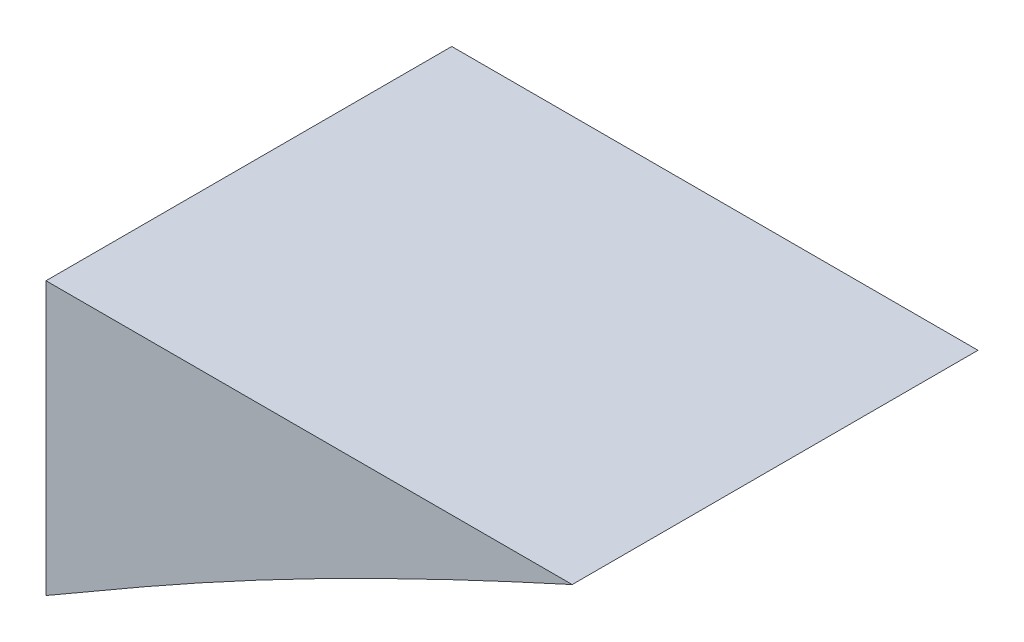
ISO-10303-21;
HEADER;
FILE_DESCRIPTION(('STEP AP214'),'2;1');
FILE_NAME('part.step','',(''),(''),'','','');
FILE_SCHEMA(('AUTOMOTIVE_DESIGN { 1 0 10303 214 1 1 1 1 }'));
ENDSEC;
DATA;
#1=APPLICATION_CONTEXT('core data for automotive mechanical design processes');
#2=APPLICATION_PROTOCOL_DEFINITION('international standard','automotive_design',2000,#1);
#3=PRODUCT_CONTEXT('',#1,'mechanical');
#4=PRODUCT('Part','Part','',(#3));
#5=PRODUCT_RELATED_PRODUCT_CATEGORY('part','',(#4));
#6=PRODUCT_DEFINITION_FORMATION('','',#4);
#7=PRODUCT_DEFINITION_CONTEXT('part definition',#1,'design');
#8=PRODUCT_DEFINITION('design','',#6,#7);
#9=PRODUCT_DEFINITION_SHAPE('','',#8);
#10=(LENGTH_UNIT() NAMED_UNIT(*) SI_UNIT(.MILLI.,.METRE.));
#11=(NAMED_UNIT(*) PLANE_ANGLE_UNIT() SI_UNIT($,.RADIAN.));
#12=(NAMED_UNIT(*) SI_UNIT($,.STERADIAN.) SOLID_ANGLE_UNIT());
#13=UNCERTAINTY_MEASURE_WITH_UNIT(LENGTH_MEASURE(1.E-05),#10,'distance_accuracy_value','');
#14=(GEOMETRIC_REPRESENTATION_CONTEXT(3) GLOBAL_UNCERTAINTY_ASSIGNED_CONTEXT((#13)) GLOBAL_UNIT_ASSIGNED_CONTEXT((#10,
#11,#12)) REPRESENTATION_CONTEXT('',''));
#15=CARTESIAN_POINT('',(0.,0.,0.));
#16=DIRECTION('',(0.,0.,1.));
#17=DIRECTION('',(1.,0.,0.));
#18=AXIS2_PLACEMENT_3D('',#15,#16,#17);
#19=CARTESIAN_POINT('',(0.,0.,8.));
#20=CARTESIAN_POINT('',(10.,4.,8.));
#21=CARTESIAN_POINT('',(9.,5.,8.));
#22=CARTESIAN_POINT('',(20.,10.,8.));
#23=B_SPLINE_CURVE_WITH_KNOTS('',3,(#19,#20,#21,#22),.UNSPECIFIED.,.F.,.F.,(4,4),(0.,1.),.UNSPECIFIED.);
#24=DIRECTION('',(0.,0.,-1.));
#25=VECTOR('',#24,1.);
#26=SURFACE_OF_LINEAR_EXTRUSION('',#23,#25);
#27=DIRECTION('',(0.,0.,-1.));
#28=VECTOR('',#27,1.);
#29=CARTESIAN_POINT('',(9.625,4.625,8.));
#30=LINE('',#29,#28);
#31=CARTESIAN_POINT('',(9.625,4.62500000563775,0.));
#32=VERTEX_POINT('',#31);
#33=CARTESIAN_POINT('',(9.625,4.62500000563775,8.));
#34=VERTEX_POINT('',#33);
#35=EDGE_CURVE('E76',#32,#34,#30,.F.);
#36=ORIENTED_EDGE('',*,*,#35,.F.);
#37=CARTESIAN_POINT('',(0.,0.,0.));
#38=CARTESIAN_POINT('',(10.,4.,0.));
#39=CARTESIAN_POINT('',(9.,5.,0.));
#40=CARTESIAN_POINT('',(20.,10.,0.));
#41=B_SPLINE_CURVE_WITH_KNOTS('',3,(#37,#38,#39,#40),.UNSPECIFIED.,.F.,.F.,(4,4),(0.,1.),.UNSPECIFIED.);
#42=CARTESIAN_POINT('',(20.,10.,0.));
#43=VERTEX_POINT('',#42);
#44=EDGE_CURVE('E83',#32,#43,#41,.T.);
#45=ORIENTED_EDGE('',*,*,#44,.T.);
#46=DIRECTION('',(0.,0.,-1.));
#47=VECTOR('',#46,1.);
#48=CARTESIAN_POINT('',(20.,10.,8.));
#49=LINE('',#48,#47);
#50=CARTESIAN_POINT('',(20.,10.,8.));
#51=VERTEX_POINT('',#50);
#52=EDGE_CURVE('E49',#51,#43,#49,.T.);
#53=ORIENTED_EDGE('',*,*,#52,.F.);
#54=EDGE_CURVE('E64',#34,#51,#23,.T.);
#55=ORIENTED_EDGE('',*,*,#54,.F.);
#56=EDGE_LOOP('',(#36,#45,#53,#55));
#57=FACE_BOUND('',#56,.T.);
#58=ADVANCED_FACE('F41',(#57),#26,.F.);
#59=CARTESIAN_POINT('',(20.,10.,8.));
#60=DIRECTION('',(0.,-1.,0.));
#61=DIRECTION('',(0.,0.,-1.));
#62=AXIS2_PLACEMENT_3D('',#59,#60,#61);
#63=PLANE('',#62);
#64=DIRECTION('',(0.,0.,-1.));
#65=VECTOR('',#64,1.);
#66=CARTESIAN_POINT('',(9.625,10.,8.));
#67=LINE('',#66,#65);
#68=CARTESIAN_POINT('',(9.625,10.,8.));
#69=VERTEX_POINT('',#68);
#70=CARTESIAN_POINT('',(9.625,10.,0.));
#71=VERTEX_POINT('',#70);
#72=EDGE_CURVE('E56',#69,#71,#67,.T.);
#73=ORIENTED_EDGE('',*,*,#72,.F.);
#74=DIRECTION('',(-1.,0.,0.));
#75=VECTOR('',#74,1.);
#76=CARTESIAN_POINT('',(20.,10.,8.));
#77=LINE('',#76,#75);
#78=EDGE_CURVE('E93',#51,#69,#77,.T.);
#79=ORIENTED_EDGE('',*,*,#78,.F.);
#80=ORIENTED_EDGE('',*,*,#52,.T.);
#81=DIRECTION('',(-1.,0.,0.));
#82=VECTOR('',#81,1.);
#83=CARTESIAN_POINT('',(20.,10.,0.));
#84=LINE('',#83,#82);
#85=EDGE_CURVE('E86',#43,#71,#84,.T.);
#86=ORIENTED_EDGE('',*,*,#85,.T.);
#87=EDGE_LOOP('',(#73,#79,#80,#86));
#88=FACE_BOUND('',#87,.T.);
#89=ADVANCED_FACE('F107',(#88),#63,.F.);
#90=CARTESIAN_POINT('',(9.625,4.625,8.));
#91=DIRECTION('',(0.,0.,-1.));
#92=DIRECTION('',(-1.,0.,0.));
#93=AXIS2_PLACEMENT_3D('',#90,#91,#92);
#94=PLANE('',#93);
#95=DIRECTION('',(0.,1.,0.));
#96=VECTOR('',#95,1.);
#97=CARTESIAN_POINT('',(9.625,-2.,8.));
#98=LINE('',#97,#96);
#99=EDGE_CURVE('E106',#34,#69,#98,.T.);
#100=ORIENTED_EDGE('',*,*,#99,.F.);
#101=ORIENTED_EDGE('',*,*,#54,.T.);
#102=ORIENTED_EDGE('',*,*,#78,.T.);
#103=EDGE_LOOP('',(#100,#101,#102));
#104=FACE_BOUND('',#103,.T.);
#105=ADVANCED_FACE('F109',(#104),#94,.F.);
#106=CARTESIAN_POINT('',(9.625,4.625,0.));
#107=DIRECTION('',(0.,0.,-1.));
#108=DIRECTION('',(-1.,0.,0.));
#109=AXIS2_PLACEMENT_3D('',#106,#107,#108);
#110=PLANE('',#109);
#111=ORIENTED_EDGE('',*,*,#44,.F.);
#112=DIRECTION('',(0.,1.,0.));
#113=VECTOR('',#112,1.);
#114=CARTESIAN_POINT('',(9.625,4.625,0.));
#115=LINE('',#114,#113);
#116=EDGE_CURVE('E11',#32,#71,#115,.T.);
#117=ORIENTED_EDGE('',*,*,#116,.T.);
#118=ORIENTED_EDGE('',*,*,#85,.F.);
#119=EDGE_LOOP('',(#111,#117,#118));
#120=FACE_BOUND('',#119,.T.);
#121=ADVANCED_FACE('F85',(#120),#110,.T.);
#122=CARTESIAN_POINT('',(9.625,-2.,8.));
#123=DIRECTION('',(-1.,0.,0.));
#124=DIRECTION('',(0.,0.,1.));
#125=AXIS2_PLACEMENT_3D('',#122,#123,#124);
#126=PLANE('',#125);
#127=ORIENTED_EDGE('',*,*,#35,.T.);
#128=ORIENTED_EDGE('',*,*,#99,.T.);
#129=ORIENTED_EDGE('',*,*,#72,.T.);
#130=ORIENTED_EDGE('',*,*,#116,.F.);
#131=EDGE_LOOP('',(#127,#128,#129,#130));
#132=FACE_BOUND('',#131,.T.);
#133=ADVANCED_FACE('F75',(#132),#126,.T.);
#134=CLOSED_SHELL('',(#58,#89,#105,#121,#133));
#135=MANIFOLD_SOLID_BREP('B2',#134);
#136=ADVANCED_BREP_SHAPE_REPRESENTATION('',(#18,#135),#14);
#137=SHAPE_DEFINITION_REPRESENTATION(#9,#136);
ENDSEC;
END-ISO-10303-21;
